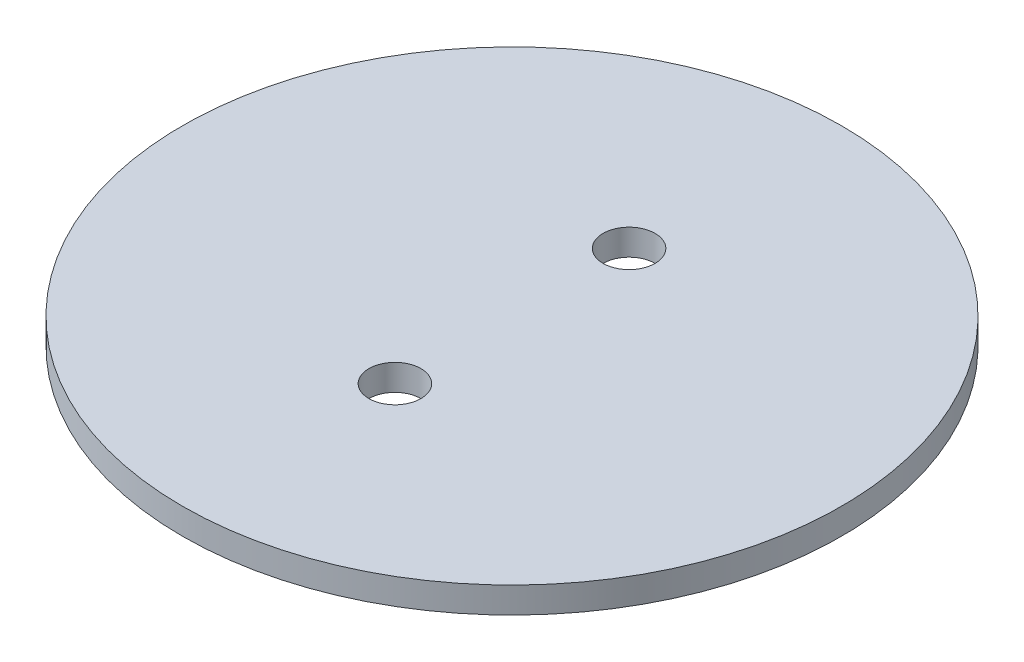
ISO-10303-21;
HEADER;
FILE_DESCRIPTION(('STEP AP214'),'2;1');
FILE_NAME('part.step','',(''),(''),'','','');
FILE_SCHEMA(('AUTOMOTIVE_DESIGN { 1 0 10303 214 1 1 1 1 }'));
ENDSEC;
DATA;
#1=APPLICATION_CONTEXT('core data for automotive mechanical design processes');
#2=APPLICATION_PROTOCOL_DEFINITION('international standard','automotive_design',2000,#1);
#3=PRODUCT_CONTEXT('',#1,'mechanical');
#4=PRODUCT('Part','Part','',(#3));
#5=PRODUCT_RELATED_PRODUCT_CATEGORY('part','',(#4));
#6=PRODUCT_DEFINITION_FORMATION('','',#4);
#7=PRODUCT_DEFINITION_CONTEXT('part definition',#1,'design');
#8=PRODUCT_DEFINITION('design','',#6,#7);
#9=PRODUCT_DEFINITION_SHAPE('','',#8);
#10=(LENGTH_UNIT() NAMED_UNIT(*) SI_UNIT(.MILLI.,.METRE.));
#11=(NAMED_UNIT(*) PLANE_ANGLE_UNIT() SI_UNIT($,.RADIAN.));
#12=(NAMED_UNIT(*) SI_UNIT($,.STERADIAN.) SOLID_ANGLE_UNIT());
#13=UNCERTAINTY_MEASURE_WITH_UNIT(LENGTH_MEASURE(1.E-05),#10,'distance_accuracy_value','');
#14=(GEOMETRIC_REPRESENTATION_CONTEXT(3) GLOBAL_UNCERTAINTY_ASSIGNED_CONTEXT((#13)) GLOBAL_UNIT_ASSIGNED_CONTEXT((#10,
#11,#12)) REPRESENTATION_CONTEXT('',''));
#15=CARTESIAN_POINT('',(0.,0.,0.));
#16=DIRECTION('',(0.,0.,1.));
#17=DIRECTION('',(1.,0.,0.));
#18=AXIS2_PLACEMENT_3D('',#15,#16,#17);
#19=CARTESIAN_POINT('',(0.,-3.,-13.5));
#20=DIRECTION('',(0.,1.,0.));
#21=DIRECTION('',(0.,0.,1.));
#22=AXIS2_PLACEMENT_3D('',#19,#20,#21);
#23=CYLINDRICAL_SURFACE('',#22,3.);
#24=CARTESIAN_POINT('',(0.,-3.,-13.5));
#25=DIRECTION('',(0.,1.,0.));
#26=DIRECTION('',(0.,0.,1.));
#27=AXIS2_PLACEMENT_3D('',#24,#25,#26);
#28=CIRCLE('',#27,3.);
#29=CARTESIAN_POINT('',(0.,-3.,-10.5));
#30=VERTEX_POINT('',#29);
#31=EDGE_CURVE('E42',#30,#30,#28,.T.);
#32=ORIENTED_EDGE('',*,*,#31,.F.);
#33=EDGE_LOOP('',(#32));
#34=FACE_BOUND('',#33,.T.);
#35=CARTESIAN_POINT('',(0.,0.,-13.5));
#36=DIRECTION('',(0.,1.,0.));
#37=DIRECTION('',(0.,0.,1.));
#38=AXIS2_PLACEMENT_3D('',#35,#36,#37);
#39=CIRCLE('',#38,3.);
#40=CARTESIAN_POINT('',(0.,0.,-10.5));
#41=VERTEX_POINT('',#40);
#42=EDGE_CURVE('E53',#41,#41,#39,.T.);
#43=ORIENTED_EDGE('',*,*,#42,.T.);
#44=EDGE_LOOP('',(#43));
#45=FACE_BOUND('',#44,.T.);
#46=ADVANCED_FACE('F34',(#34,#45),#23,.F.);
#47=CARTESIAN_POINT('',(0.,-3.,13.5));
#48=DIRECTION('',(0.,1.,0.));
#49=DIRECTION('',(0.,0.,1.));
#50=AXIS2_PLACEMENT_3D('',#47,#48,#49);
#51=CYLINDRICAL_SURFACE('',#50,3.);
#52=CARTESIAN_POINT('',(0.,-3.,13.5));
#53=DIRECTION('',(0.,1.,0.));
#54=DIRECTION('',(0.,0.,1.));
#55=AXIS2_PLACEMENT_3D('',#52,#53,#54);
#56=CIRCLE('',#55,3.);
#57=CARTESIAN_POINT('',(0.,-3.,16.5));
#58=VERTEX_POINT('',#57);
#59=EDGE_CURVE('E47',#58,#58,#56,.T.);
#60=ORIENTED_EDGE('',*,*,#59,.F.);
#61=EDGE_LOOP('',(#60));
#62=FACE_BOUND('',#61,.T.);
#63=CARTESIAN_POINT('',(0.,0.,13.5));
#64=DIRECTION('',(0.,1.,0.));
#65=DIRECTION('',(0.,0.,1.));
#66=AXIS2_PLACEMENT_3D('',#63,#64,#65);
#67=CIRCLE('',#66,3.);
#68=CARTESIAN_POINT('',(0.,0.,16.5));
#69=VERTEX_POINT('',#68);
#70=EDGE_CURVE('E51',#69,#69,#67,.T.);
#71=ORIENTED_EDGE('',*,*,#70,.T.);
#72=EDGE_LOOP('',(#71));
#73=FACE_BOUND('',#72,.T.);
#74=ADVANCED_FACE('F36',(#62,#73),#51,.F.);
#75=CARTESIAN_POINT('',(0.,-3.,0.));
#76=DIRECTION('',(0.,1.,0.));
#77=DIRECTION('',(0.,0.,1.));
#78=AXIS2_PLACEMENT_3D('',#75,#76,#77);
#79=CYLINDRICAL_SURFACE('',#78,38.);
#80=CARTESIAN_POINT('',(0.,-3.,0.));
#81=DIRECTION('',(0.,1.,0.));
#82=DIRECTION('',(0.,0.,1.));
#83=AXIS2_PLACEMENT_3D('',#80,#81,#82);
#84=CIRCLE('',#83,38.);
#85=CARTESIAN_POINT('',(0.,-3.,38.));
#86=VERTEX_POINT('',#85);
#87=EDGE_CURVE('E10',#86,#86,#84,.T.);
#88=ORIENTED_EDGE('',*,*,#87,.T.);
#89=EDGE_LOOP('',(#88));
#90=FACE_BOUND('',#89,.T.);
#91=CARTESIAN_POINT('',(0.,0.,0.));
#92=DIRECTION('',(0.,1.,0.));
#93=DIRECTION('',(0.,0.,1.));
#94=AXIS2_PLACEMENT_3D('',#91,#92,#93);
#95=CIRCLE('',#94,38.);
#96=CARTESIAN_POINT('',(0.,0.,38.));
#97=VERTEX_POINT('',#96);
#98=EDGE_CURVE('E38',#97,#97,#95,.T.);
#99=ORIENTED_EDGE('',*,*,#98,.F.);
#100=EDGE_LOOP('',(#99));
#101=FACE_BOUND('',#100,.T.);
#102=ADVANCED_FACE('F68',(#90,#101),#79,.T.);
#103=CARTESIAN_POINT('',(0.,-3.,0.));
#104=DIRECTION('',(0.,1.,0.));
#105=DIRECTION('',(0.,0.,1.));
#106=AXIS2_PLACEMENT_3D('',#103,#104,#105);
#107=PLANE('',#106);
#108=ORIENTED_EDGE('',*,*,#59,.T.);
#109=EDGE_LOOP('',(#108));
#110=FACE_BOUND('',#109,.T.);
#111=ORIENTED_EDGE('',*,*,#31,.T.);
#112=EDGE_LOOP('',(#111));
#113=FACE_BOUND('',#112,.T.);
#114=ORIENTED_EDGE('',*,*,#87,.F.);
#115=EDGE_LOOP('',(#114));
#116=FACE_BOUND('',#115,.T.);
#117=ADVANCED_FACE('F63',(#110,#113,#116),#107,.F.);
#118=CARTESIAN_POINT('',(0.,0.,0.));
#119=DIRECTION('',(0.,1.,0.));
#120=DIRECTION('',(0.,0.,1.));
#121=AXIS2_PLACEMENT_3D('',#118,#119,#120);
#122=PLANE('',#121);
#123=ORIENTED_EDGE('',*,*,#70,.F.);
#124=EDGE_LOOP('',(#123));
#125=FACE_BOUND('',#124,.T.);
#126=ORIENTED_EDGE('',*,*,#42,.F.);
#127=EDGE_LOOP('',(#126));
#128=FACE_BOUND('',#127,.T.);
#129=ORIENTED_EDGE('',*,*,#98,.T.);
#130=EDGE_LOOP('',(#129));
#131=FACE_BOUND('',#130,.T.);
#132=ADVANCED_FACE('F71',(#125,#128,#131),#122,.T.);
#133=CLOSED_SHELL('',(#46,#74,#102,#117,#132));
#134=MANIFOLD_SOLID_BREP('B2',#133);
#135=ADVANCED_BREP_SHAPE_REPRESENTATION('',(#18,#134),#14);
#136=SHAPE_DEFINITION_REPRESENTATION(#9,#135);
ENDSEC;
END-ISO-10303-21;
